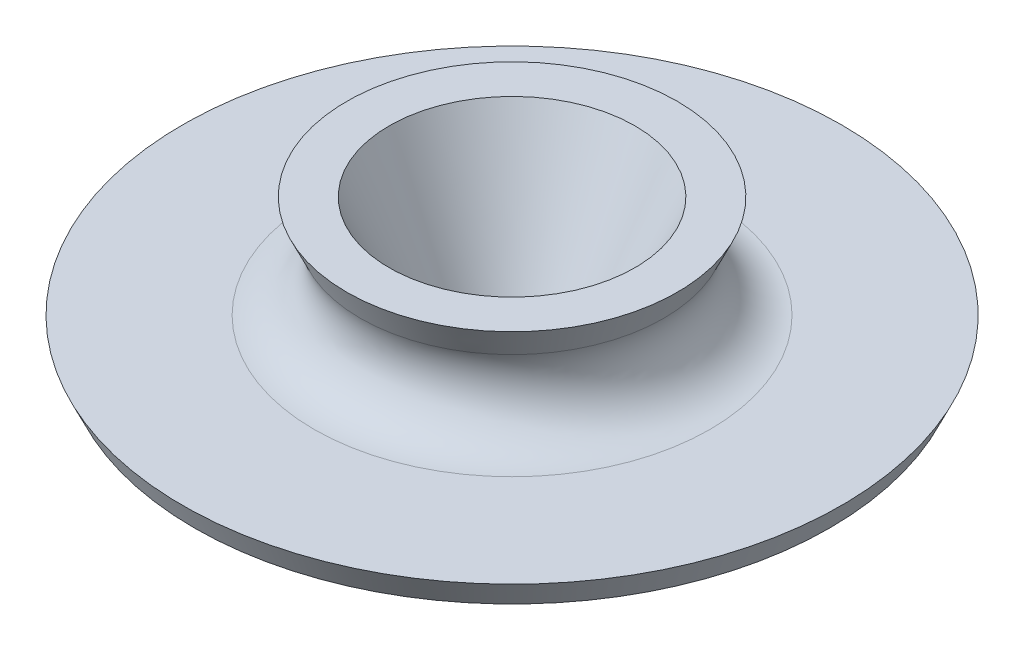
ISO-10303-21;
HEADER;
FILE_DESCRIPTION(('STEP AP214'),'2;1');
FILE_NAME('part.step','',(''),(''),'','','');
FILE_SCHEMA(('AUTOMOTIVE_DESIGN { 1 0 10303 214 1 1 1 1 }'));
ENDSEC;
DATA;
#1=APPLICATION_CONTEXT('core data for automotive mechanical design processes');
#2=APPLICATION_PROTOCOL_DEFINITION('international standard','automotive_design',2000,#1);
#3=PRODUCT_CONTEXT('',#1,'mechanical');
#4=PRODUCT('Part','Part','',(#3));
#5=PRODUCT_RELATED_PRODUCT_CATEGORY('part','',(#4));
#6=PRODUCT_DEFINITION_FORMATION('','',#4);
#7=PRODUCT_DEFINITION_CONTEXT('part definition',#1,'design');
#8=PRODUCT_DEFINITION('design','',#6,#7);
#9=PRODUCT_DEFINITION_SHAPE('','',#8);
#10=(LENGTH_UNIT() NAMED_UNIT(*) SI_UNIT(.MILLI.,.METRE.));
#11=(NAMED_UNIT(*) PLANE_ANGLE_UNIT() SI_UNIT($,.RADIAN.));
#12=(NAMED_UNIT(*) SI_UNIT($,.STERADIAN.) SOLID_ANGLE_UNIT());
#13=UNCERTAINTY_MEASURE_WITH_UNIT(LENGTH_MEASURE(1.E-05),#10,'distance_accuracy_value','');
#14=(GEOMETRIC_REPRESENTATION_CONTEXT(3) GLOBAL_UNCERTAINTY_ASSIGNED_CONTEXT((#13)) GLOBAL_UNIT_ASSIGNED_CONTEXT((#10,
#11,#12)) REPRESENTATION_CONTEXT('',''));
#15=CARTESIAN_POINT('',(0.,0.,0.));
#16=DIRECTION('',(0.,0.,1.));
#17=DIRECTION('',(1.,0.,0.));
#18=AXIS2_PLACEMENT_3D('',#15,#16,#17);
#19=CARTESIAN_POINT('',(0.,0.,0.));
#20=DIRECTION('',(0.,1.,0.));
#21=DIRECTION('',(0.,0.,1.));
#22=AXIS2_PLACEMENT_3D('',#19,#20,#21);
#23=CONICAL_SURFACE('',#22,12.7,0.436332312998576);
#24=CARTESIAN_POINT('',(0.,38.1,0.));
#25=DIRECTION('',(0.,-1.,0.));
#26=DIRECTION('',(0.,0.,-1.));
#27=AXIS2_PLACEMENT_3D('',#24,#25,#26);
#28=CIRCLE('',#27,30.4663217757052);
#29=CARTESIAN_POINT('',(0.,38.1,-30.4663217757052));
#30=VERTEX_POINT('',#29);
#31=EDGE_CURVE('E77',#30,#30,#28,.T.);
#32=ORIENTED_EDGE('',*,*,#31,.F.);
#33=EDGE_LOOP('',(#32));
#34=FACE_BOUND('',#33,.T.);
#35=CARTESIAN_POINT('',(0.,0.,0.));
#36=DIRECTION('',(0.,-1.,0.));
#37=DIRECTION('',(0.,0.,-1.));
#38=AXIS2_PLACEMENT_3D('',#35,#36,#37);
#39=CIRCLE('',#38,12.7);
#40=CARTESIAN_POINT('',(0.,0.,-12.7));
#41=VERTEX_POINT('',#40);
#42=EDGE_CURVE('E50',#41,#41,#39,.T.);
#43=ORIENTED_EDGE('',*,*,#42,.T.);
#44=EDGE_LOOP('',(#43));
#45=FACE_BOUND('',#44,.T.);
#46=ADVANCED_FACE('F37',(#34,#45),#23,.F.);
#47=CARTESIAN_POINT('',(-12.7,0.,0.));
#48=DIRECTION('',(0.,1.,0.));
#49=DIRECTION('',(0.,0.,1.));
#50=AXIS2_PLACEMENT_3D('',#47,#48,#49);
#51=PLANE('',#50);
#52=ORIENTED_EDGE('',*,*,#42,.F.);
#53=EDGE_LOOP('',(#52));
#54=FACE_BOUND('',#53,.T.);
#55=CARTESIAN_POINT('',(0.,0.,0.));
#56=DIRECTION('',(0.,-1.,0.));
#57=DIRECTION('',(0.,0.,-1.));
#58=AXIS2_PLACEMENT_3D('',#55,#56,#57);
#59=CIRCLE('',#58,19.7064497854118);
#60=CARTESIAN_POINT('',(0.,0.,-19.7064497854118));
#61=VERTEX_POINT('',#60);
#62=EDGE_CURVE('E55',#61,#61,#59,.T.);
#63=ORIENTED_EDGE('',*,*,#62,.T.);
#64=EDGE_LOOP('',(#63));
#65=FACE_BOUND('',#64,.T.);
#66=ADVANCED_FACE('F86',(#54,#65),#51,.F.);
#67=CARTESIAN_POINT('',(0.,6.35,0.));
#68=DIRECTION('',(0.,1.,0.));
#69=DIRECTION('',(0.,0.,1.));
#70=AXIS2_PLACEMENT_3D('',#67,#68,#69);
#71=CONICAL_SURFACE('',#70,22.667503414696,0.436332312998576);
#72=ORIENTED_EDGE('',*,*,#62,.F.);
#73=EDGE_LOOP('',(#72));
#74=FACE_BOUND('',#73,.T.);
#75=CARTESIAN_POINT('',(0.,6.35,0.));
#76=DIRECTION('',(0.,-1.,0.));
#77=DIRECTION('',(0.,0.,-1.));
#78=AXIS2_PLACEMENT_3D('',#75,#76,#77);
#79=CIRCLE('',#78,22.667503414696);
#80=CARTESIAN_POINT('',(0.,6.35,-22.667503414696));
#81=VERTEX_POINT('',#80);
#82=EDGE_CURVE('E61',#81,#81,#79,.T.);
#83=ORIENTED_EDGE('',*,*,#82,.T.);
#84=EDGE_LOOP('',(#83));
#85=FACE_BOUND('',#84,.T.);
#86=ADVANCED_FACE('F91',(#74,#85),#71,.T.);
#87=CARTESIAN_POINT('',(-22.667503414696,6.35,0.));
#88=DIRECTION('',(0.,1.,0.));
#89=DIRECTION('',(0.,0.,1.));
#90=AXIS2_PLACEMENT_3D('',#87,#88,#89);
#91=PLANE('',#90);
#92=ORIENTED_EDGE('',*,*,#82,.F.);
#93=EDGE_LOOP('',(#92));
#94=FACE_BOUND('',#93,.T.);
#95=CARTESIAN_POINT('',(0.,6.34999999999999,0.));
#96=DIRECTION('',(0.,-1.,0.));
#97=DIRECTION('',(0.,0.,-1.));
#98=AXIS2_PLACEMENT_3D('',#95,#96,#97);
#99=CIRCLE('',#98,78.7191016979904);
#100=CARTESIAN_POINT('',(0.,6.34999999999999,-78.7191016979904));
#101=VERTEX_POINT('',#100);
#102=EDGE_CURVE('E65',#101,#101,#99,.T.);
#103=ORIENTED_EDGE('',*,*,#102,.T.);
#104=EDGE_LOOP('',(#103));
#105=FACE_BOUND('',#104,.T.);
#106=ADVANCED_FACE('F97',(#94,#105),#91,.F.);
#107=CARTESIAN_POINT('',(0.,12.7,0.));
#108=DIRECTION('',(0.,1.,0.));
#109=DIRECTION('',(0.,0.,1.));
#110=AXIS2_PLACEMENT_3D('',#107,#108,#109);
#111=CONICAL_SURFACE('',#110,81.6801553272746,0.436332312998577);
#112=ORIENTED_EDGE('',*,*,#102,.F.);
#113=EDGE_LOOP('',(#112));
#114=FACE_BOUND('',#113,.T.);
#115=CARTESIAN_POINT('',(0.,12.7,0.));
#116=DIRECTION('',(0.,-1.,0.));
#117=DIRECTION('',(0.,0.,-1.));
#118=AXIS2_PLACEMENT_3D('',#115,#116,#117);
#119=CIRCLE('',#118,81.6801553272746);
#120=CARTESIAN_POINT('',(0.,12.7,-81.6801553272746));
#121=VERTEX_POINT('',#120);
#122=EDGE_CURVE('E69',#121,#121,#119,.T.);
#123=ORIENTED_EDGE('',*,*,#122,.T.);
#124=EDGE_LOOP('',(#123));
#125=FACE_BOUND('',#124,.T.);
#126=ADVANCED_FACE('F103',(#114,#125),#111,.T.);
#127=CARTESIAN_POINT('',(-81.6801553272746,12.7,0.));
#128=DIRECTION('',(0.,-1.,0.));
#129=DIRECTION('',(0.,0.,-1.));
#130=AXIS2_PLACEMENT_3D('',#127,#128,#129);
#131=PLANE('',#130);
#132=CARTESIAN_POINT('',(0.,12.7,0.));
#133=DIRECTION('',(0.,-1.,0.));
#134=DIRECTION('',(0.,0.,-1.));
#135=AXIS2_PLACEMENT_3D('',#132,#133,#134);
#136=CIRCLE('',#135,49.0667887660781);
#137=CARTESIAN_POINT('',(0.,12.7,-49.0667887660781));
#138=VERTEX_POINT('',#137);
#139=EDGE_CURVE('E45',#138,#138,#136,.T.);
#140=ORIENTED_EDGE('',*,*,#139,.T.);
#141=EDGE_LOOP('',(#140));
#142=FACE_BOUND('',#141,.T.);
#143=ORIENTED_EDGE('',*,*,#122,.F.);
#144=EDGE_LOOP('',(#143));
#145=FACE_BOUND('',#144,.T.);
#146=ADVANCED_FACE('F109',(#142,#145),#131,.F.);
#147=CARTESIAN_POINT('',(0.,38.1,0.));
#148=DIRECTION('',(0.,1.,0.));
#149=DIRECTION('',(0.,0.,1.));
#150=AXIS2_PLACEMENT_3D('',#147,#148,#149);
#151=CONICAL_SURFACE('',#150,40.9759964538229,0.436332312998576);
#152=CARTESIAN_POINT('',(0.,30.7672519241068,0.));
#153=DIRECTION('',(0.,1.,0.));
#154=DIRECTION('',(0.,0.,1.));
#155=AXIS2_PLACEMENT_3D('',#152,#153,#154);
#156=CIRCLE('',#155,37.5566798707126);
#157=CARTESIAN_POINT('',(0.,30.7672519241068,37.5566798707126));
#158=VERTEX_POINT('',#157);
#159=EDGE_CURVE('E10',#158,#158,#156,.T.);
#160=ORIENTED_EDGE('',*,*,#159,.T.);
#161=EDGE_LOOP('',(#160));
#162=FACE_BOUND('',#161,.T.);
#163=CARTESIAN_POINT('',(0.,38.1,0.));
#164=DIRECTION('',(0.,-1.,0.));
#165=DIRECTION('',(0.,0.,-1.));
#166=AXIS2_PLACEMENT_3D('',#163,#164,#165);
#167=CIRCLE('',#166,40.9759964538229);
#168=CARTESIAN_POINT('',(0.,38.1,-40.9759964538229));
#169=VERTEX_POINT('',#168);
#170=EDGE_CURVE('E73',#169,#169,#167,.T.);
#171=ORIENTED_EDGE('',*,*,#170,.T.);
#172=EDGE_LOOP('',(#171));
#173=FACE_BOUND('',#172,.T.);
#174=ADVANCED_FACE('F114',(#162,#173),#151,.T.);
#175=CARTESIAN_POINT('',(-40.9759964538229,38.1,0.));
#176=DIRECTION('',(0.,-1.,0.));
#177=DIRECTION('',(0.,0.,-1.));
#178=AXIS2_PLACEMENT_3D('',#175,#176,#177);
#179=PLANE('',#178);
#180=ORIENTED_EDGE('',*,*,#170,.F.);
#181=EDGE_LOOP('',(#180));
#182=FACE_BOUND('',#181,.T.);
#183=ORIENTED_EDGE('',*,*,#31,.T.);
#184=EDGE_LOOP('',(#183));
#185=FACE_BOUND('',#184,.T.);
#186=ADVANCED_FACE('F82',(#182,#185),#179,.F.);
#187=CARTESIAN_POINT('',(0.,25.4,0.));
#188=DIRECTION('',(0.,-1.,0.));
#189=DIRECTION('',(0.,0.,-1.));
#190=AXIS2_PLACEMENT_3D('',#187,#188,#189);
#191=TOROIDAL_SURFACE('',#190,49.0667887660781,12.7);
#192=ORIENTED_EDGE('',*,*,#159,.F.);
#193=EDGE_LOOP('',(#192));
#194=FACE_BOUND('',#193,.T.);
#195=ORIENTED_EDGE('',*,*,#139,.F.);
#196=EDGE_LOOP('',(#195));
#197=FACE_BOUND('',#196,.T.);
#198=ADVANCED_FACE('F39',(#194,#197),#191,.F.);
#199=CLOSED_SHELL('',(#46,#66,#86,#106,#126,#146,#174,#186,#198));
#200=MANIFOLD_SOLID_BREP('B2',#199);
#201=ADVANCED_BREP_SHAPE_REPRESENTATION('',(#18,#200),#14);
#202=SHAPE_DEFINITION_REPRESENTATION(#9,#201);
ENDSEC;
END-ISO-10303-21;
